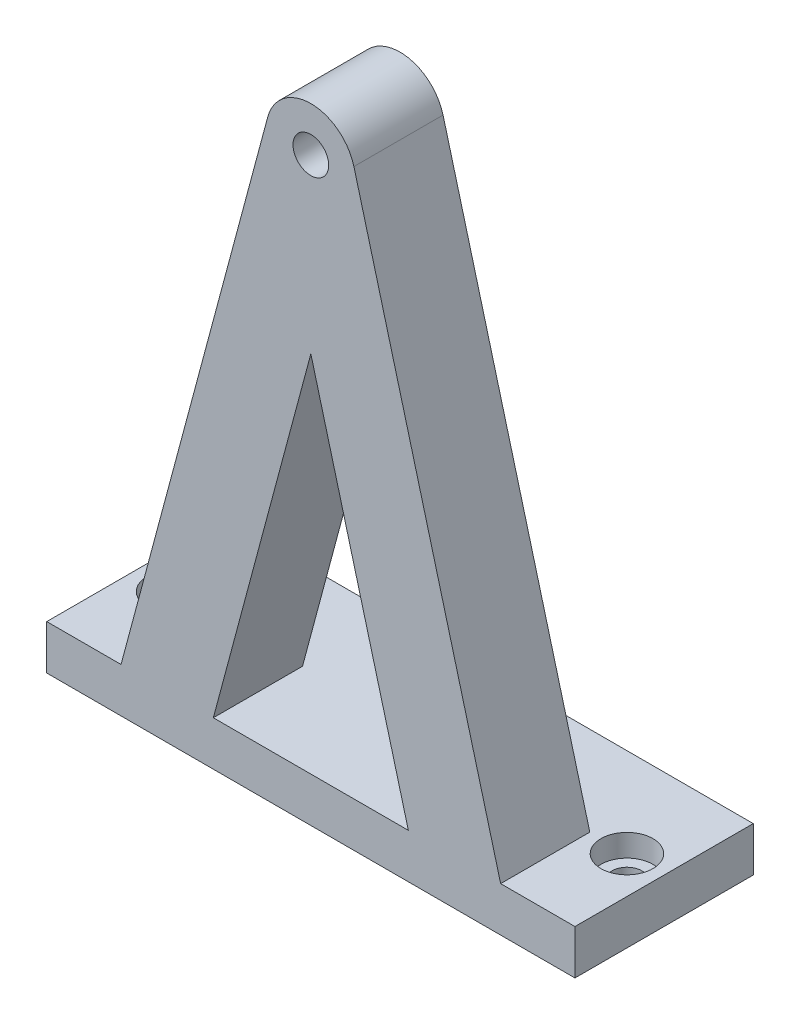
ISO-10303-21;
HEADER;
FILE_DESCRIPTION(('STEP AP214'),'2;1');
FILE_NAME('part.step','',(''),(''),'','','');
FILE_SCHEMA(('AUTOMOTIVE_DESIGN { 1 0 10303 214 1 1 1 1 }'));
ENDSEC;
DATA;
#1=APPLICATION_CONTEXT('core data for automotive mechanical design processes');
#2=APPLICATION_PROTOCOL_DEFINITION('international standard','automotive_design',2000,#1);
#3=PRODUCT_CONTEXT('',#1,'mechanical');
#4=PRODUCT('Part','Part','',(#3));
#5=PRODUCT_RELATED_PRODUCT_CATEGORY('part','',(#4));
#6=PRODUCT_DEFINITION_FORMATION('','',#4);
#7=PRODUCT_DEFINITION_CONTEXT('part definition',#1,'design');
#8=PRODUCT_DEFINITION('design','',#6,#7);
#9=PRODUCT_DEFINITION_SHAPE('','',#8);
#10=(LENGTH_UNIT() NAMED_UNIT(*) SI_UNIT(.MILLI.,.METRE.));
#11=(NAMED_UNIT(*) PLANE_ANGLE_UNIT() SI_UNIT($,.RADIAN.));
#12=(NAMED_UNIT(*) SI_UNIT($,.STERADIAN.) SOLID_ANGLE_UNIT());
#13=UNCERTAINTY_MEASURE_WITH_UNIT(LENGTH_MEASURE(1.E-05),#10,'distance_accuracy_value','');
#14=(GEOMETRIC_REPRESENTATION_CONTEXT(3) GLOBAL_UNCERTAINTY_ASSIGNED_CONTEXT((#13)) GLOBAL_UNIT_ASSIGNED_CONTEXT((#10,
#11,#12)) REPRESENTATION_CONTEXT('',''));
#15=CARTESIAN_POINT('',(0.,0.,0.));
#16=DIRECTION('',(0.,0.,1.));
#17=DIRECTION('',(1.,0.,0.));
#18=AXIS2_PLACEMENT_3D('',#15,#16,#17);
#19=CARTESIAN_POINT('',(-2.89777747886721,-0.776457135307543,6.));
#20=DIRECTION('',(-0.96592582628907,-0.258819045102515,0.));
#21=DIRECTION('',(0.258819045102515,-0.96592582628907,0.));
#22=AXIS2_PLACEMENT_3D('',#19,#20,#21);
#23=PLANE('',#22);
#24=DIRECTION('',(-0.258819045102515,0.96592582628907,0.));
#25=VECTOR('',#24,1.);
#26=CARTESIAN_POINT('',(-2.89777747886721,-0.776457135307543,0.));
#27=LINE('',#26,#25);
#28=CARTESIAN_POINT('',(6.56160013547145,-36.079335,0.));
#29=VERTEX_POINT('',#28);
#30=CARTESIAN_POINT('',(0.,-11.5911099154691,0.));
#31=VERTEX_POINT('',#30);
#32=EDGE_CURVE('E147',#29,#31,#27,.T.);
#33=ORIENTED_EDGE('',*,*,#32,.F.);
#34=DIRECTION('',(0.,0.,-1.));
#35=VECTOR('',#34,1.);
#36=CARTESIAN_POINT('',(6.56160013547145,-36.079335,6.));
#37=LINE('',#36,#35);
#38=CARTESIAN_POINT('',(6.56160013547145,-36.079335,6.));
#39=VERTEX_POINT('',#38);
#40=EDGE_CURVE('E74',#39,#29,#37,.T.);
#41=ORIENTED_EDGE('',*,*,#40,.F.);
#42=DIRECTION('',(-0.258819045102515,0.96592582628907,0.));
#43=VECTOR('',#42,1.);
#44=CARTESIAN_POINT('',(-2.89777747886721,-0.776457135307543,6.));
#45=LINE('',#44,#43);
#46=CARTESIAN_POINT('',(0.,-11.5911099154691,6.));
#47=VERTEX_POINT('',#46);
#48=EDGE_CURVE('E136',#39,#47,#45,.T.);
#49=ORIENTED_EDGE('',*,*,#48,.T.);
#50=DIRECTION('',(0.,0.,-1.));
#51=VECTOR('',#50,1.);
#52=CARTESIAN_POINT('',(0.,-11.5911099154691,6.));
#53=LINE('',#52,#51);
#54=EDGE_CURVE('E12',#47,#31,#53,.T.);
#55=ORIENTED_EDGE('',*,*,#54,.T.);
#56=EDGE_LOOP('',(#33,#41,#49,#55));
#57=FACE_BOUND('',#56,.T.);
#58=ADVANCED_FACE('F65',(#57),#23,.T.);
#59=CARTESIAN_POINT('',(2.89777747886722,0.776457135307548,6.));
#60=DIRECTION('',(0.96592582628907,0.258819045102515,0.));
#61=DIRECTION('',(-0.258819045102515,0.96592582628907,0.));
#62=AXIS2_PLACEMENT_3D('',#59,#60,#61);
#63=PLANE('',#62);
#64=DIRECTION('',(0.258819045102515,-0.96592582628907,0.));
#65=VECTOR('',#64,1.);
#66=CARTESIAN_POINT('',(2.89777747886722,0.776457135307548,0.));
#67=LINE('',#66,#65);
#68=CARTESIAN_POINT('',(2.89777747886721,0.776457135307546,0.));
#69=VERTEX_POINT('',#68);
#70=CARTESIAN_POINT('',(12.773257217932,-36.079335,0.));
#71=VERTEX_POINT('',#70);
#72=EDGE_CURVE('E120',#69,#71,#67,.T.);
#73=ORIENTED_EDGE('',*,*,#72,.F.);
#74=DIRECTION('',(0.,0.,-1.));
#75=VECTOR('',#74,1.);
#76=CARTESIAN_POINT('',(2.89777747886721,0.776457135307546,6.));
#77=LINE('',#76,#75);
#78=CARTESIAN_POINT('',(2.89777747886721,0.776457135307546,6.));
#79=VERTEX_POINT('',#78);
#80=EDGE_CURVE('E97',#79,#69,#77,.T.);
#81=ORIENTED_EDGE('',*,*,#80,.F.);
#82=DIRECTION('',(0.258819045102515,-0.96592582628907,0.));
#83=VECTOR('',#82,1.);
#84=CARTESIAN_POINT('',(2.89777747886722,0.776457135307548,6.));
#85=LINE('',#84,#83);
#86=CARTESIAN_POINT('',(12.773257217932,-36.079335,6.));
#87=VERTEX_POINT('',#86);
#88=EDGE_CURVE('E118',#79,#87,#85,.T.);
#89=ORIENTED_EDGE('',*,*,#88,.T.);
#90=DIRECTION('',(0.,0.,-1.));
#91=VECTOR('',#90,1.);
#92=CARTESIAN_POINT('',(12.773257217932,-36.079335,6.));
#93=LINE('',#92,#91);
#94=EDGE_CURVE('E121',#87,#71,#93,.T.);
#95=ORIENTED_EDGE('',*,*,#94,.T.);
#96=EDGE_LOOP('',(#73,#81,#89,#95));
#97=FACE_BOUND('',#96,.T.);
#98=ADVANCED_FACE('F115',(#97),#63,.T.);
#99=CARTESIAN_POINT('',(0.,0.,6.));
#100=DIRECTION('',(0.,0.,-1.));
#101=DIRECTION('',(-1.,0.,0.));
#102=AXIS2_PLACEMENT_3D('',#99,#100,#101);
#103=CYLINDRICAL_SURFACE('',#102,3.);
#104=CARTESIAN_POINT('',(0.,0.,0.));
#105=DIRECTION('',(0.,0.,1.));
#106=DIRECTION('',(1.,0.,0.));
#107=AXIS2_PLACEMENT_3D('',#104,#105,#106);
#108=CIRCLE('',#107,3.);
#109=CARTESIAN_POINT('',(-2.89777747886722,0.776457135307544,0.));
#110=VERTEX_POINT('',#109);
#111=EDGE_CURVE('E101',#69,#110,#108,.T.);
#112=ORIENTED_EDGE('',*,*,#111,.T.);
#113=DIRECTION('',(0.,0.,-1.));
#114=VECTOR('',#113,1.);
#115=CARTESIAN_POINT('',(-2.89777747886722,0.776457135307544,6.));
#116=LINE('',#115,#114);
#117=CARTESIAN_POINT('',(-2.89777747886722,0.776457135307544,6.));
#118=VERTEX_POINT('',#117);
#119=EDGE_CURVE('E122',#118,#110,#116,.T.);
#120=ORIENTED_EDGE('',*,*,#119,.F.);
#121=CARTESIAN_POINT('',(0.,0.,6.));
#122=DIRECTION('',(0.,0.,1.));
#123=DIRECTION('',(1.,0.,0.));
#124=AXIS2_PLACEMENT_3D('',#121,#122,#123);
#125=CIRCLE('',#124,3.);
#126=EDGE_CURVE('E124',#79,#118,#125,.T.);
#127=ORIENTED_EDGE('',*,*,#126,.F.);
#128=ORIENTED_EDGE('',*,*,#80,.T.);
#129=EDGE_LOOP('',(#112,#120,#127,#128));
#130=FACE_BOUND('',#129,.T.);
#131=ADVANCED_FACE('F125',(#130),#103,.T.);
#132=CARTESIAN_POINT('',(-2.89777747886723,0.776457135307546,6.));
#133=DIRECTION('',(0.96592582628907,-0.258819045102514,0.));
#134=DIRECTION('',(0.258819045102514,0.96592582628907,0.));
#135=AXIS2_PLACEMENT_3D('',#132,#133,#134);
#136=PLANE('',#135);
#137=DIRECTION('',(-0.258819045102514,-0.96592582628907,0.));
#138=VECTOR('',#137,1.);
#139=CARTESIAN_POINT('',(-2.89777747886723,0.776457135307546,0.));
#140=LINE('',#139,#138);
#141=CARTESIAN_POINT('',(-12.7732572179319,-36.079335,0.));
#142=VERTEX_POINT('',#141);
#143=EDGE_CURVE('E156',#110,#142,#140,.T.);
#144=ORIENTED_EDGE('',*,*,#143,.T.);
#145=DIRECTION('',(0.,0.,-1.));
#146=VECTOR('',#145,1.);
#147=CARTESIAN_POINT('',(-12.7732572179319,-36.079335,6.));
#148=LINE('',#147,#146);
#149=CARTESIAN_POINT('',(-12.7732572179319,-36.079335,6.));
#150=VERTEX_POINT('',#149);
#151=EDGE_CURVE('E164',#150,#142,#148,.T.);
#152=ORIENTED_EDGE('',*,*,#151,.F.);
#153=DIRECTION('',(-0.258819045102514,-0.96592582628907,0.));
#154=VECTOR('',#153,1.);
#155=CARTESIAN_POINT('',(-2.89777747886723,0.776457135307546,6.));
#156=LINE('',#155,#154);
#157=EDGE_CURVE('E129',#118,#150,#156,.T.);
#158=ORIENTED_EDGE('',*,*,#157,.F.);
#159=ORIENTED_EDGE('',*,*,#119,.T.);
#160=EDGE_LOOP('',(#144,#152,#158,#159));
#161=FACE_BOUND('',#160,.T.);
#162=ADVANCED_FACE('F320',(#161),#136,.F.);
#163=CARTESIAN_POINT('',(2.89777747886722,-0.776457135307545,6.));
#164=DIRECTION('',(-0.96592582628907,0.258819045102514,0.));
#165=DIRECTION('',(-0.258819045102514,-0.96592582628907,0.));
#166=AXIS2_PLACEMENT_3D('',#163,#164,#165);
#167=PLANE('',#166);
#168=DIRECTION('',(0.258819045102514,0.96592582628907,0.));
#169=VECTOR('',#168,1.);
#170=CARTESIAN_POINT('',(2.89777747886722,-0.776457135307545,0.));
#171=LINE('',#170,#169);
#172=CARTESIAN_POINT('',(-6.5616001354714,-36.079335,0.));
#173=VERTEX_POINT('',#172);
#174=EDGE_CURVE('E144',#173,#31,#171,.T.);
#175=ORIENTED_EDGE('',*,*,#174,.T.);
#176=ORIENTED_EDGE('',*,*,#54,.F.);
#177=DIRECTION('',(0.258819045102514,0.96592582628907,0.));
#178=VECTOR('',#177,1.);
#179=CARTESIAN_POINT('',(2.89777747886722,-0.776457135307545,6.));
#180=LINE('',#179,#178);
#181=CARTESIAN_POINT('',(-6.56160013547141,-36.079335,6.));
#182=VERTEX_POINT('',#181);
#183=EDGE_CURVE('E106',#182,#47,#180,.T.);
#184=ORIENTED_EDGE('',*,*,#183,.F.);
#185=DIRECTION('',(0.,0.,-1.));
#186=VECTOR('',#185,1.);
#187=CARTESIAN_POINT('',(-6.56160013547141,-36.079335,6.));
#188=LINE('',#187,#186);
#189=EDGE_CURVE('E143',#182,#173,#188,.T.);
#190=ORIENTED_EDGE('',*,*,#189,.T.);
#191=EDGE_LOOP('',(#175,#176,#184,#190));
#192=FACE_BOUND('',#191,.T.);
#193=ADVANCED_FACE('F67',(#192),#167,.F.);
#194=CARTESIAN_POINT('',(0.,0.,0.));
#195=DIRECTION('',(0.,0.,1.));
#196=DIRECTION('',(1.,0.,0.));
#197=AXIS2_PLACEMENT_3D('',#194,#195,#196);
#198=PLANE('',#197);
#199=CARTESIAN_POINT('',(0.,0.,0.));
#200=DIRECTION('',(0.,0.,1.));
#201=DIRECTION('',(1.,0.,0.));
#202=AXIS2_PLACEMENT_3D('',#199,#200,#201);
#203=CIRCLE('',#202,1.2);
#204=CARTESIAN_POINT('',(1.2,0.,0.));
#205=VERTEX_POINT('',#204);
#206=EDGE_CURVE('E256',#205,#205,#203,.T.);
#207=ORIENTED_EDGE('',*,*,#206,.T.);
#208=EDGE_LOOP('',(#207));
#209=FACE_BOUND('',#208,.T.);
#210=ORIENTED_EDGE('',*,*,#174,.F.);
#211=DIRECTION('',(1.,0.,0.));
#212=VECTOR('',#211,1.);
#213=CARTESIAN_POINT('',(0.,-36.079335,0.));
#214=LINE('',#213,#212);
#215=EDGE_CURVE('E159',#142,#173,#214,.T.);
#216=ORIENTED_EDGE('',*,*,#215,.F.);
#217=ORIENTED_EDGE('',*,*,#143,.F.);
#218=ORIENTED_EDGE('',*,*,#111,.F.);
#219=ORIENTED_EDGE('',*,*,#72,.T.);
#220=DIRECTION('',(1.,0.,0.));
#221=VECTOR('',#220,1.);
#222=CARTESIAN_POINT('',(0.,-36.079335,0.));
#223=LINE('',#222,#221);
#224=EDGE_CURVE('E151',#29,#71,#223,.T.);
#225=ORIENTED_EDGE('',*,*,#224,.F.);
#226=ORIENTED_EDGE('',*,*,#32,.T.);
#227=EDGE_LOOP('',(#210,#216,#217,#218,#219,#225,#226));
#228=FACE_BOUND('',#227,.T.);
#229=ADVANCED_FACE('F183',(#209,#228),#198,.F.);
#230=CARTESIAN_POINT('',(0.,0.,6.));
#231=DIRECTION('',(0.,0.,1.));
#232=DIRECTION('',(1.,0.,0.));
#233=AXIS2_PLACEMENT_3D('',#230,#231,#232);
#234=PLANE('',#233);
#235=CARTESIAN_POINT('',(0.,0.,6.));
#236=DIRECTION('',(0.,0.,1.));
#237=DIRECTION('',(1.,0.,0.));
#238=AXIS2_PLACEMENT_3D('',#235,#236,#237);
#239=CIRCLE('',#238,1.2);
#240=CARTESIAN_POINT('',(1.2,0.,6.));
#241=VERTEX_POINT('',#240);
#242=EDGE_CURVE('E253',#241,#241,#239,.T.);
#243=ORIENTED_EDGE('',*,*,#242,.F.);
#244=EDGE_LOOP('',(#243));
#245=FACE_BOUND('',#244,.T.);
#246=DIRECTION('',(-1.,0.,0.));
#247=VECTOR('',#246,1.);
#248=CARTESIAN_POINT('',(17.773257217932,-36.079335,6.));
#249=LINE('',#248,#247);
#250=EDGE_CURVE('E82',#39,#182,#249,.T.);
#251=ORIENTED_EDGE('',*,*,#250,.T.);
#252=ORIENTED_EDGE('',*,*,#183,.T.);
#253=ORIENTED_EDGE('',*,*,#48,.F.);
#254=EDGE_LOOP('',(#251,#252,#253));
#255=FACE_BOUND('',#254,.T.);
#256=ORIENTED_EDGE('',*,*,#157,.T.);
#257=CARTESIAN_POINT('',(-17.7732572179319,-36.079335,6.));
#258=VERTEX_POINT('',#257);
#259=EDGE_CURVE('E251',#150,#258,#249,.T.);
#260=ORIENTED_EDGE('',*,*,#259,.T.);
#261=DIRECTION('',(0.,1.,0.));
#262=VECTOR('',#261,1.);
#263=CARTESIAN_POINT('',(-17.7732572179319,-39.079335,6.));
#264=LINE('',#263,#262);
#265=CARTESIAN_POINT('',(-17.7732572179319,-39.079335,6.));
#266=VERTEX_POINT('',#265);
#267=EDGE_CURVE('E221',#266,#258,#264,.T.);
#268=ORIENTED_EDGE('',*,*,#267,.F.);
#269=DIRECTION('',(-1.,0.,0.));
#270=VECTOR('',#269,1.);
#271=CARTESIAN_POINT('',(17.773257217932,-39.079335,6.));
#272=LINE('',#271,#270);
#273=CARTESIAN_POINT('',(17.773257217932,-39.079335,6.));
#274=VERTEX_POINT('',#273);
#275=EDGE_CURVE('E216',#274,#266,#272,.T.);
#276=ORIENTED_EDGE('',*,*,#275,.F.);
#277=DIRECTION('',(0.,1.,0.));
#278=VECTOR('',#277,1.);
#279=CARTESIAN_POINT('',(17.773257217932,-39.079335,6.));
#280=LINE('',#279,#278);
#281=CARTESIAN_POINT('',(17.773257217932,-36.079335,6.));
#282=VERTEX_POINT('',#281);
#283=EDGE_CURVE('E148',#274,#282,#280,.T.);
#284=ORIENTED_EDGE('',*,*,#283,.T.);
#285=EDGE_CURVE('E134',#282,#87,#249,.T.);
#286=ORIENTED_EDGE('',*,*,#285,.T.);
#287=ORIENTED_EDGE('',*,*,#88,.F.);
#288=ORIENTED_EDGE('',*,*,#126,.T.);
#289=EDGE_LOOP('',(#256,#260,#268,#276,#284,#286,#287,#288));
#290=FACE_BOUND('',#289,.T.);
#291=ADVANCED_FACE('F131',(#245,#255,#290),#234,.T.);
#292=CARTESIAN_POINT('',(0.,-36.079335,0.));
#293=DIRECTION('',(0.,-1.,0.));
#294=DIRECTION('',(0.,0.,-1.));
#295=AXIS2_PLACEMENT_3D('',#292,#293,#294);
#296=PLANE('',#295);
#297=CARTESIAN_POINT('',(15.2732572179319,-36.079335,0.));
#298=DIRECTION('',(0.,1.,0.));
#299=DIRECTION('',(0.,0.,1.));
#300=AXIS2_PLACEMENT_3D('',#297,#298,#299);
#301=CIRCLE('',#300,1.75);
#302=CARTESIAN_POINT('',(15.2732572179319,-36.079335,1.75));
#303=VERTEX_POINT('',#302);
#304=EDGE_CURVE('E275',#303,#303,#301,.T.);
#305=ORIENTED_EDGE('',*,*,#304,.F.);
#306=EDGE_LOOP('',(#305));
#307=FACE_BOUND('',#306,.T.);
#308=CARTESIAN_POINT('',(-15.2732572179319,-36.079335,0.));
#309=DIRECTION('',(0.,1.,0.));
#310=DIRECTION('',(0.,0.,1.));
#311=AXIS2_PLACEMENT_3D('',#308,#309,#310);
#312=CIRCLE('',#311,1.75);
#313=CARTESIAN_POINT('',(-15.2732572179319,-36.079335,1.75));
#314=VERTEX_POINT('',#313);
#315=EDGE_CURVE('E272',#314,#314,#312,.T.);
#316=ORIENTED_EDGE('',*,*,#315,.F.);
#317=EDGE_LOOP('',(#316));
#318=FACE_BOUND('',#317,.T.);
#319=CARTESIAN_POINT('',(0.,-36.079335,-3.));
#320=DIRECTION('',(0.,1.,0.));
#321=DIRECTION('',(0.,0.,1.));
#322=AXIS2_PLACEMENT_3D('',#319,#320,#321);
#323=CIRCLE('',#322,1.75);
#324=CARTESIAN_POINT('',(0.,-36.079335,-1.25));
#325=VERTEX_POINT('',#324);
#326=EDGE_CURVE('E265',#325,#325,#323,.T.);
#327=ORIENTED_EDGE('',*,*,#326,.F.);
#328=EDGE_LOOP('',(#327));
#329=FACE_BOUND('',#328,.T.);
#330=ORIENTED_EDGE('',*,*,#259,.F.);
#331=ORIENTED_EDGE('',*,*,#151,.T.);
#332=ORIENTED_EDGE('',*,*,#215,.T.);
#333=ORIENTED_EDGE('',*,*,#189,.F.);
#334=ORIENTED_EDGE('',*,*,#250,.F.);
#335=ORIENTED_EDGE('',*,*,#40,.T.);
#336=ORIENTED_EDGE('',*,*,#224,.T.);
#337=ORIENTED_EDGE('',*,*,#94,.F.);
#338=ORIENTED_EDGE('',*,*,#285,.F.);
#339=DIRECTION('',(0.,0.,1.));
#340=VECTOR('',#339,1.);
#341=CARTESIAN_POINT('',(17.773257217932,-36.079335,-6.));
#342=LINE('',#341,#340);
#343=CARTESIAN_POINT('',(17.773257217932,-36.079335,-6.));
#344=VERTEX_POINT('',#343);
#345=EDGE_CURVE('E238',#344,#282,#342,.T.);
#346=ORIENTED_EDGE('',*,*,#345,.F.);
#347=DIRECTION('',(1.,0.,0.));
#348=VECTOR('',#347,1.);
#349=CARTESIAN_POINT('',(17.773257217932,-36.079335,-6.));
#350=LINE('',#349,#348);
#351=CARTESIAN_POINT('',(-17.7732572179319,-36.079335,-6.));
#352=VERTEX_POINT('',#351);
#353=EDGE_CURVE('E234',#352,#344,#350,.T.);
#354=ORIENTED_EDGE('',*,*,#353,.F.);
#355=DIRECTION('',(0.,0.,-1.));
#356=VECTOR('',#355,1.);
#357=CARTESIAN_POINT('',(-17.7732572179319,-36.079335,-6.));
#358=LINE('',#357,#356);
#359=EDGE_CURVE('E248',#258,#352,#358,.T.);
#360=ORIENTED_EDGE('',*,*,#359,.F.);
#361=EDGE_LOOP('',(#330,#331,#332,#333,#334,#335,#336,#337,#338,#346,#354,#360));
#362=FACE_BOUND('',#361,.T.);
#363=ADVANCED_FACE('F174',(#307,#318,#329,#362),#296,.F.);
#364=CARTESIAN_POINT('',(17.773257217932,-39.079335,-6.));
#365=DIRECTION('',(-1.,0.,0.));
#366=DIRECTION('',(0.,0.,1.));
#367=AXIS2_PLACEMENT_3D('',#364,#365,#366);
#368=PLANE('',#367);
#369=ORIENTED_EDGE('',*,*,#345,.T.);
#370=ORIENTED_EDGE('',*,*,#283,.F.);
#371=DIRECTION('',(0.,0.,1.));
#372=VECTOR('',#371,1.);
#373=CARTESIAN_POINT('',(17.773257217932,-39.079335,-6.));
#374=LINE('',#373,#372);
#375=CARTESIAN_POINT('',(17.773257217932,-39.079335,-6.));
#376=VERTEX_POINT('',#375);
#377=EDGE_CURVE('E225',#376,#274,#374,.T.);
#378=ORIENTED_EDGE('',*,*,#377,.F.);
#379=DIRECTION('',(0.,1.,0.));
#380=VECTOR('',#379,1.);
#381=CARTESIAN_POINT('',(17.773257217932,-39.079335,-6.));
#382=LINE('',#381,#380);
#383=EDGE_CURVE('E245',#376,#344,#382,.T.);
#384=ORIENTED_EDGE('',*,*,#383,.T.);
#385=EDGE_LOOP('',(#369,#370,#378,#384));
#386=FACE_BOUND('',#385,.T.);
#387=ADVANCED_FACE('F236',(#386),#368,.F.);
#388=CARTESIAN_POINT('',(-17.7732572179319,-39.079335,-6.));
#389=DIRECTION('',(1.,0.,0.));
#390=DIRECTION('',(0.,0.,-1.));
#391=AXIS2_PLACEMENT_3D('',#388,#389,#390);
#392=PLANE('',#391);
#393=ORIENTED_EDGE('',*,*,#359,.T.);
#394=DIRECTION('',(0.,1.,0.));
#395=VECTOR('',#394,1.);
#396=CARTESIAN_POINT('',(-17.7732572179319,-39.079335,-6.));
#397=LINE('',#396,#395);
#398=CARTESIAN_POINT('',(-17.7732572179319,-39.079335,-6.));
#399=VERTEX_POINT('',#398);
#400=EDGE_CURVE('E240',#399,#352,#397,.T.);
#401=ORIENTED_EDGE('',*,*,#400,.F.);
#402=DIRECTION('',(0.,0.,-1.));
#403=VECTOR('',#402,1.);
#404=CARTESIAN_POINT('',(-17.7732572179319,-39.079335,-6.));
#405=LINE('',#404,#403);
#406=EDGE_CURVE('E224',#266,#399,#405,.T.);
#407=ORIENTED_EDGE('',*,*,#406,.F.);
#408=ORIENTED_EDGE('',*,*,#267,.T.);
#409=EDGE_LOOP('',(#393,#401,#407,#408));
#410=FACE_BOUND('',#409,.T.);
#411=ADVANCED_FACE('F332',(#410),#392,.F.);
#412=CARTESIAN_POINT('',(17.773257217932,-39.079335,-6.));
#413=DIRECTION('',(0.,0.,1.));
#414=DIRECTION('',(1.,0.,0.));
#415=AXIS2_PLACEMENT_3D('',#412,#413,#414);
#416=PLANE('',#415);
#417=ORIENTED_EDGE('',*,*,#353,.T.);
#418=ORIENTED_EDGE('',*,*,#383,.F.);
#419=DIRECTION('',(1.,0.,0.));
#420=VECTOR('',#419,1.);
#421=CARTESIAN_POINT('',(17.773257217932,-39.079335,-6.));
#422=LINE('',#421,#420);
#423=EDGE_CURVE('E230',#399,#376,#422,.T.);
#424=ORIENTED_EDGE('',*,*,#423,.F.);
#425=ORIENTED_EDGE('',*,*,#400,.T.);
#426=EDGE_LOOP('',(#417,#418,#424,#425));
#427=FACE_BOUND('',#426,.T.);
#428=ADVANCED_FACE('F335',(#427),#416,.F.);
#429=CARTESIAN_POINT('',(0.,-39.079335,0.));
#430=DIRECTION('',(0.,-1.,0.));
#431=DIRECTION('',(0.,0.,-1.));
#432=AXIS2_PLACEMENT_3D('',#429,#430,#431);
#433=PLANE('',#432);
#434=CARTESIAN_POINT('',(0.,-39.079335,-3.));
#435=DIRECTION('',(0.,1.,0.));
#436=DIRECTION('',(0.,0.,1.));
#437=AXIS2_PLACEMENT_3D('',#434,#435,#436);
#438=CIRCLE('',#437,1.);
#439=CARTESIAN_POINT('',(0.,-39.079335,-2.));
#440=VERTEX_POINT('',#439);
#441=EDGE_CURVE('E288',#440,#440,#438,.T.);
#442=ORIENTED_EDGE('',*,*,#441,.T.);
#443=EDGE_LOOP('',(#442));
#444=FACE_BOUND('',#443,.T.);
#445=CARTESIAN_POINT('',(15.2732572179319,-39.079335,0.));
#446=DIRECTION('',(0.,1.,0.));
#447=DIRECTION('',(0.,0.,1.));
#448=AXIS2_PLACEMENT_3D('',#445,#446,#447);
#449=CIRCLE('',#448,1.);
#450=CARTESIAN_POINT('',(15.2732572179319,-39.079335,1.));
#451=VERTEX_POINT('',#450);
#452=EDGE_CURVE('E292',#451,#451,#449,.T.);
#453=ORIENTED_EDGE('',*,*,#452,.T.);
#454=EDGE_LOOP('',(#453));
#455=FACE_BOUND('',#454,.T.);
#456=CARTESIAN_POINT('',(-15.2732572179319,-39.079335,0.));
#457=DIRECTION('',(0.,1.,0.));
#458=DIRECTION('',(0.,0.,1.));
#459=AXIS2_PLACEMENT_3D('',#456,#457,#458);
#460=CIRCLE('',#459,1.);
#461=CARTESIAN_POINT('',(-15.2732572179319,-39.079335,1.));
#462=VERTEX_POINT('',#461);
#463=EDGE_CURVE('E289',#462,#462,#460,.T.);
#464=ORIENTED_EDGE('',*,*,#463,.T.);
#465=EDGE_LOOP('',(#464));
#466=FACE_BOUND('',#465,.T.);
#467=ORIENTED_EDGE('',*,*,#377,.T.);
#468=ORIENTED_EDGE('',*,*,#275,.T.);
#469=ORIENTED_EDGE('',*,*,#406,.T.);
#470=ORIENTED_EDGE('',*,*,#423,.T.);
#471=EDGE_LOOP('',(#467,#468,#469,#470));
#472=FACE_BOUND('',#471,.T.);
#473=ADVANCED_FACE('F228',(#444,#455,#466,#472),#433,.T.);
#474=CARTESIAN_POINT('',(0.,0.,6.));
#475=DIRECTION('',(0.,0.,-1.));
#476=DIRECTION('',(-1.,0.,0.));
#477=AXIS2_PLACEMENT_3D('',#474,#475,#476);
#478=CYLINDRICAL_SURFACE('',#477,1.2);
#479=ORIENTED_EDGE('',*,*,#242,.T.);
#480=EDGE_LOOP('',(#479));
#481=FACE_BOUND('',#480,.T.);
#482=ORIENTED_EDGE('',*,*,#206,.F.);
#483=EDGE_LOOP('',(#482));
#484=FACE_BOUND('',#483,.T.);
#485=ADVANCED_FACE('F345',(#481,#484),#478,.F.);
#486=CARTESIAN_POINT('',(0.,-37.579335,-3.));
#487=DIRECTION('',(0.,1.,0.));
#488=DIRECTION('',(0.,0.,1.));
#489=AXIS2_PLACEMENT_3D('',#486,#487,#488);
#490=CYLINDRICAL_SURFACE('',#489,1.75);
#491=CARTESIAN_POINT('',(0.,-37.579335,-3.));
#492=DIRECTION('',(0.,1.,0.));
#493=DIRECTION('',(0.,0.,1.));
#494=AXIS2_PLACEMENT_3D('',#491,#492,#493);
#495=CIRCLE('',#494,1.75);
#496=CARTESIAN_POINT('',(0.,-37.579335,-1.25));
#497=VERTEX_POINT('',#496);
#498=EDGE_CURVE('E262',#497,#497,#495,.T.);
#499=ORIENTED_EDGE('',*,*,#498,.F.);
#500=EDGE_LOOP('',(#499));
#501=FACE_BOUND('',#500,.T.);
#502=ORIENTED_EDGE('',*,*,#326,.T.);
#503=EDGE_LOOP('',(#502));
#504=FACE_BOUND('',#503,.T.);
#505=ADVANCED_FACE('F348',(#501,#504),#490,.F.);
#506=CARTESIAN_POINT('',(0.,-37.579335,-3.));
#507=DIRECTION('',(0.,1.,0.));
#508=DIRECTION('',(0.,0.,1.));
#509=AXIS2_PLACEMENT_3D('',#506,#507,#508);
#510=PLANE('',#509);
#511=CARTESIAN_POINT('',(0.,-37.579335,-3.));
#512=DIRECTION('',(0.,1.,0.));
#513=DIRECTION('',(0.,0.,1.));
#514=AXIS2_PLACEMENT_3D('',#511,#512,#513);
#515=CIRCLE('',#514,1.);
#516=CARTESIAN_POINT('',(0.,-37.579335,-2.));
#517=VERTEX_POINT('',#516);
#518=EDGE_CURVE('E266',#517,#517,#515,.T.);
#519=ORIENTED_EDGE('',*,*,#518,.F.);
#520=EDGE_LOOP('',(#519));
#521=FACE_BOUND('',#520,.T.);
#522=ORIENTED_EDGE('',*,*,#498,.T.);
#523=EDGE_LOOP('',(#522));
#524=FACE_BOUND('',#523,.T.);
#525=ADVANCED_FACE('F350',(#521,#524),#510,.T.);
#526=CARTESIAN_POINT('',(-15.2732572179319,-37.579335,0.));
#527=DIRECTION('',(0.,1.,0.));
#528=DIRECTION('',(0.,0.,1.));
#529=AXIS2_PLACEMENT_3D('',#526,#527,#528);
#530=CYLINDRICAL_SURFACE('',#529,1.75);
#531=CARTESIAN_POINT('',(-15.2732572179319,-37.579335,0.));
#532=DIRECTION('',(0.,1.,0.));
#533=DIRECTION('',(0.,0.,1.));
#534=AXIS2_PLACEMENT_3D('',#531,#532,#533);
#535=CIRCLE('',#534,1.75);
#536=CARTESIAN_POINT('',(-15.2732572179319,-37.579335,1.75));
#537=VERTEX_POINT('',#536);
#538=EDGE_CURVE('E269',#537,#537,#535,.T.);
#539=ORIENTED_EDGE('',*,*,#538,.F.);
#540=EDGE_LOOP('',(#539));
#541=FACE_BOUND('',#540,.T.);
#542=ORIENTED_EDGE('',*,*,#315,.T.);
#543=EDGE_LOOP('',(#542));
#544=FACE_BOUND('',#543,.T.);
#545=ADVANCED_FACE('F353',(#541,#544),#530,.F.);
#546=CARTESIAN_POINT('',(-15.2732572179319,-37.579335,0.));
#547=DIRECTION('',(0.,1.,0.));
#548=DIRECTION('',(0.,0.,1.));
#549=AXIS2_PLACEMENT_3D('',#546,#547,#548);
#550=PLANE('',#549);
#551=CARTESIAN_POINT('',(-15.2732572179319,-37.579335,0.));
#552=DIRECTION('',(0.,1.,0.));
#553=DIRECTION('',(0.,0.,1.));
#554=AXIS2_PLACEMENT_3D('',#551,#552,#553);
#555=CIRCLE('',#554,1.);
#556=CARTESIAN_POINT('',(-15.2732572179319,-37.579335,1.));
#557=VERTEX_POINT('',#556);
#558=EDGE_CURVE('E282',#557,#557,#555,.T.);
#559=ORIENTED_EDGE('',*,*,#558,.F.);
#560=EDGE_LOOP('',(#559));
#561=FACE_BOUND('',#560,.T.);
#562=ORIENTED_EDGE('',*,*,#538,.T.);
#563=EDGE_LOOP('',(#562));
#564=FACE_BOUND('',#563,.T.);
#565=ADVANCED_FACE('F358',(#561,#564),#550,.T.);
#566=CARTESIAN_POINT('',(15.2732572179319,-37.579335,0.));
#567=DIRECTION('',(0.,1.,0.));
#568=DIRECTION('',(0.,0.,1.));
#569=AXIS2_PLACEMENT_3D('',#566,#567,#568);
#570=CYLINDRICAL_SURFACE('',#569,1.75);
#571=CARTESIAN_POINT('',(15.2732572179319,-37.579335,0.));
#572=DIRECTION('',(0.,1.,0.));
#573=DIRECTION('',(0.,0.,1.));
#574=AXIS2_PLACEMENT_3D('',#571,#572,#573);
#575=CIRCLE('',#574,1.75);
#576=CARTESIAN_POINT('',(15.2732572179319,-37.579335,1.75));
#577=VERTEX_POINT('',#576);
#578=EDGE_CURVE('E259',#577,#577,#575,.T.);
#579=ORIENTED_EDGE('',*,*,#578,.F.);
#580=EDGE_LOOP('',(#579));
#581=FACE_BOUND('',#580,.T.);
#582=ORIENTED_EDGE('',*,*,#304,.T.);
#583=EDGE_LOOP('',(#582));
#584=FACE_BOUND('',#583,.T.);
#585=ADVANCED_FACE('F361',(#581,#584),#570,.F.);
#586=CARTESIAN_POINT('',(15.2732572179319,-37.579335,0.));
#587=DIRECTION('',(0.,1.,0.));
#588=DIRECTION('',(0.,0.,1.));
#589=AXIS2_PLACEMENT_3D('',#586,#587,#588);
#590=PLANE('',#589);
#591=CARTESIAN_POINT('',(15.2732572179319,-37.579335,0.));
#592=DIRECTION('',(0.,1.,0.));
#593=DIRECTION('',(0.,0.,1.));
#594=AXIS2_PLACEMENT_3D('',#591,#592,#593);
#595=CIRCLE('',#594,1.);
#596=CARTESIAN_POINT('',(15.2732572179319,-37.579335,1.));
#597=VERTEX_POINT('',#596);
#598=EDGE_CURVE('E285',#597,#597,#595,.T.);
#599=ORIENTED_EDGE('',*,*,#598,.F.);
#600=EDGE_LOOP('',(#599));
#601=FACE_BOUND('',#600,.T.);
#602=ORIENTED_EDGE('',*,*,#578,.T.);
#603=EDGE_LOOP('',(#602));
#604=FACE_BOUND('',#603,.T.);
#605=ADVANCED_FACE('F368',(#601,#604),#590,.T.);
#606=CARTESIAN_POINT('',(15.2732572179319,-39.079335,0.));
#607=DIRECTION('',(0.,1.,0.));
#608=DIRECTION('',(0.,0.,1.));
#609=AXIS2_PLACEMENT_3D('',#606,#607,#608);
#610=CYLINDRICAL_SURFACE('',#609,1.);
#611=ORIENTED_EDGE('',*,*,#598,.T.);
#612=EDGE_LOOP('',(#611));
#613=FACE_BOUND('',#612,.T.);
#614=ORIENTED_EDGE('',*,*,#452,.F.);
#615=EDGE_LOOP('',(#614));
#616=FACE_BOUND('',#615,.T.);
#617=ADVANCED_FACE('F308',(#613,#616),#610,.F.);
#618=CARTESIAN_POINT('',(-15.2732572179319,-39.079335,0.));
#619=DIRECTION('',(0.,1.,0.));
#620=DIRECTION('',(0.,0.,1.));
#621=AXIS2_PLACEMENT_3D('',#618,#619,#620);
#622=CYLINDRICAL_SURFACE('',#621,1.);
#623=ORIENTED_EDGE('',*,*,#558,.T.);
#624=EDGE_LOOP('',(#623));
#625=FACE_BOUND('',#624,.T.);
#626=ORIENTED_EDGE('',*,*,#463,.F.);
#627=EDGE_LOOP('',(#626));
#628=FACE_BOUND('',#627,.T.);
#629=ADVANCED_FACE('F302',(#625,#628),#622,.F.);
#630=CARTESIAN_POINT('',(0.,-39.079335,-3.));
#631=DIRECTION('',(0.,1.,0.));
#632=DIRECTION('',(0.,0.,1.));
#633=AXIS2_PLACEMENT_3D('',#630,#631,#632);
#634=CYLINDRICAL_SURFACE('',#633,1.);
#635=ORIENTED_EDGE('',*,*,#518,.T.);
#636=EDGE_LOOP('',(#635));
#637=FACE_BOUND('',#636,.T.);
#638=ORIENTED_EDGE('',*,*,#441,.F.);
#639=EDGE_LOOP('',(#638));
#640=FACE_BOUND('',#639,.T.);
#641=ADVANCED_FACE('F300',(#637,#640),#634,.F.);
#642=CLOSED_SHELL('',(#58,#98,#131,#162,#193,#229,#291,#363,#387,#411,#428,#473,#485,#505,#525,
#545,#565,#585,#605,#617,#629,#641));
#643=MANIFOLD_SOLID_BREP('B2',#642);
#644=ADVANCED_BREP_SHAPE_REPRESENTATION('',(#18,#643),#14);
#645=SHAPE_DEFINITION_REPRESENTATION(#9,#644);
ENDSEC;
END-ISO-10303-21;
